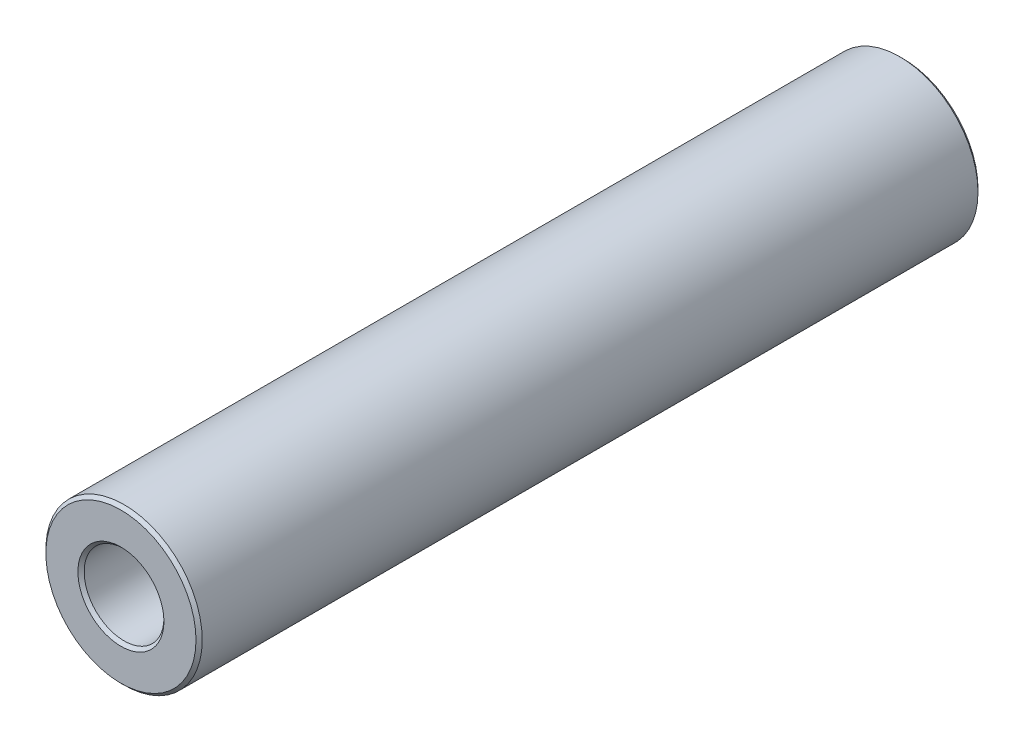
ISO-10303-21;
HEADER;
FILE_DESCRIPTION(('STEP AP214'),'2;1');
FILE_NAME('part.step','',(''),(''),'','','');
FILE_SCHEMA(('AUTOMOTIVE_DESIGN { 1 0 10303 214 1 1 1 1 }'));
ENDSEC;
DATA;
#1=APPLICATION_CONTEXT('core data for automotive mechanical design processes');
#2=APPLICATION_PROTOCOL_DEFINITION('international standard','automotive_design',2000,#1);
#3=PRODUCT_CONTEXT('',#1,'mechanical');
#4=PRODUCT('Part','Part','',(#3));
#5=PRODUCT_RELATED_PRODUCT_CATEGORY('part','',(#4));
#6=PRODUCT_DEFINITION_FORMATION('','',#4);
#7=PRODUCT_DEFINITION_CONTEXT('part definition',#1,'design');
#8=PRODUCT_DEFINITION('design','',#6,#7);
#9=PRODUCT_DEFINITION_SHAPE('','',#8);
#10=(LENGTH_UNIT() NAMED_UNIT(*) SI_UNIT(.MILLI.,.METRE.));
#11=(NAMED_UNIT(*) PLANE_ANGLE_UNIT() SI_UNIT($,.RADIAN.));
#12=(NAMED_UNIT(*) SI_UNIT($,.STERADIAN.) SOLID_ANGLE_UNIT());
#13=UNCERTAINTY_MEASURE_WITH_UNIT(LENGTH_MEASURE(1.E-05),#10,'distance_accuracy_value','');
#14=(GEOMETRIC_REPRESENTATION_CONTEXT(3) GLOBAL_UNCERTAINTY_ASSIGNED_CONTEXT((#13)) GLOBAL_UNIT_ASSIGNED_CONTEXT((#10,
#11,#12)) REPRESENTATION_CONTEXT('',''));
#15=CARTESIAN_POINT('',(0.,0.,0.));
#16=DIRECTION('',(0.,0.,1.));
#17=DIRECTION('',(1.,0.,0.));
#18=AXIS2_PLACEMENT_3D('',#15,#16,#17);
#19=CARTESIAN_POINT('',(0.,0.,50.));
#20=DIRECTION('',(0.,0.,1.));
#21=DIRECTION('',(1.,0.,0.));
#22=AXIS2_PLACEMENT_3D('',#19,#20,#21);
#23=PLANE('',#22);
#24=CARTESIAN_POINT('',(0.,0.,50.));
#25=DIRECTION('',(0.,0.,1.));
#26=DIRECTION('',(1.,0.,0.));
#27=AXIS2_PLACEMENT_3D('',#24,#25,#26);
#28=CIRCLE('',#27,2.75);
#29=CARTESIAN_POINT('',(2.75,0.,50.));
#30=VERTEX_POINT('',#29);
#31=EDGE_CURVE('E10',#30,#30,#28,.F.);
#32=ORIENTED_EDGE('',*,*,#31,.T.);
#33=EDGE_LOOP('',(#32));
#34=FACE_BOUND('',#33,.T.);
#35=CARTESIAN_POINT('',(0.,0.,50.));
#36=DIRECTION('',(0.,0.,1.));
#37=DIRECTION('',(1.,0.,0.));
#38=AXIS2_PLACEMENT_3D('',#35,#36,#37);
#39=CIRCLE('',#38,4.8);
#40=CARTESIAN_POINT('',(4.8,0.,50.));
#41=VERTEX_POINT('',#40);
#42=EDGE_CURVE('E37',#41,#41,#39,.T.);
#43=ORIENTED_EDGE('',*,*,#42,.T.);
#44=EDGE_LOOP('',(#43));
#45=FACE_BOUND('',#44,.T.);
#46=ADVANCED_FACE('F30',(#34,#45),#23,.T.);
#47=CARTESIAN_POINT('',(0.,0.,0.));
#48=DIRECTION('',(0.,0.,1.));
#49=DIRECTION('',(1.,0.,0.));
#50=AXIS2_PLACEMENT_3D('',#47,#48,#49);
#51=PLANE('',#50);
#52=CARTESIAN_POINT('',(0.,0.,0.));
#53=DIRECTION('',(0.,0.,1.));
#54=DIRECTION('',(1.,0.,0.));
#55=AXIS2_PLACEMENT_3D('',#52,#53,#54);
#56=CIRCLE('',#55,4.80000000000001);
#57=CARTESIAN_POINT('',(4.80000000000001,0.,0.));
#58=VERTEX_POINT('',#57);
#59=EDGE_CURVE('E50',#58,#58,#56,.F.);
#60=ORIENTED_EDGE('',*,*,#59,.T.);
#61=EDGE_LOOP('',(#60));
#62=FACE_BOUND('',#61,.T.);
#63=CARTESIAN_POINT('',(0.,0.,0.));
#64=DIRECTION('',(0.,0.,1.));
#65=DIRECTION('',(1.,0.,0.));
#66=AXIS2_PLACEMENT_3D('',#63,#64,#65);
#67=CIRCLE('',#66,2.75);
#68=CARTESIAN_POINT('',(2.75,0.,0.));
#69=VERTEX_POINT('',#68);
#70=EDGE_CURVE('E53',#69,#69,#67,.T.);
#71=ORIENTED_EDGE('',*,*,#70,.T.);
#72=EDGE_LOOP('',(#71));
#73=FACE_BOUND('',#72,.T.);
#74=ADVANCED_FACE('F74',(#62,#73),#51,.F.);
#75=CARTESIAN_POINT('',(0.,0.,50.));
#76=DIRECTION('',(0.,0.,-1.));
#77=DIRECTION('',(-1.,0.,0.));
#78=AXIS2_PLACEMENT_3D('',#75,#76,#77);
#79=CYLINDRICAL_SURFACE('',#78,5.);
#80=CARTESIAN_POINT('',(0.,0.,0.199999999999992));
#81=DIRECTION('',(0.,0.,1.));
#82=DIRECTION('',(1.,0.,0.));
#83=AXIS2_PLACEMENT_3D('',#80,#81,#82);
#84=CIRCLE('',#83,5.);
#85=CARTESIAN_POINT('',(5.,0.,0.199999999999992));
#86=VERTEX_POINT('',#85);
#87=EDGE_CURVE('E56',#86,#86,#84,.T.);
#88=ORIENTED_EDGE('',*,*,#87,.T.);
#89=EDGE_LOOP('',(#88));
#90=FACE_BOUND('',#89,.T.);
#91=CARTESIAN_POINT('',(0.,0.,49.8));
#92=DIRECTION('',(0.,0.,1.));
#93=DIRECTION('',(1.,0.,0.));
#94=AXIS2_PLACEMENT_3D('',#91,#92,#93);
#95=CIRCLE('',#94,5.);
#96=CARTESIAN_POINT('',(5.,0.,49.8));
#97=VERTEX_POINT('',#96);
#98=EDGE_CURVE('E59',#97,#97,#95,.F.);
#99=ORIENTED_EDGE('',*,*,#98,.T.);
#100=EDGE_LOOP('',(#99));
#101=FACE_BOUND('',#100,.T.);
#102=ADVANCED_FACE('F63',(#90,#101),#79,.T.);
#103=CARTESIAN_POINT('',(0.,0.,50.));
#104=DIRECTION('',(0.,0.,-1.));
#105=DIRECTION('',(-1.,0.,0.));
#106=AXIS2_PLACEMENT_3D('',#103,#104,#105);
#107=CYLINDRICAL_SURFACE('',#106,2.55);
#108=CARTESIAN_POINT('',(0.,0.,0.200000000000006));
#109=DIRECTION('',(0.,0.,1.));
#110=DIRECTION('',(1.,0.,0.));
#111=AXIS2_PLACEMENT_3D('',#108,#109,#110);
#112=CIRCLE('',#111,2.55);
#113=CARTESIAN_POINT('',(2.55,0.,0.200000000000006));
#114=VERTEX_POINT('',#113);
#115=EDGE_CURVE('E41',#114,#114,#112,.F.);
#116=ORIENTED_EDGE('',*,*,#115,.T.);
#117=EDGE_LOOP('',(#116));
#118=FACE_BOUND('',#117,.T.);
#119=CARTESIAN_POINT('',(0.,0.,49.8));
#120=DIRECTION('',(0.,0.,1.));
#121=DIRECTION('',(1.,0.,0.));
#122=AXIS2_PLACEMENT_3D('',#119,#120,#121);
#123=CIRCLE('',#122,2.55);
#124=CARTESIAN_POINT('',(2.55,0.,49.8));
#125=VERTEX_POINT('',#124);
#126=EDGE_CURVE('E45',#125,#125,#123,.T.);
#127=ORIENTED_EDGE('',*,*,#126,.T.);
#128=EDGE_LOOP('',(#127));
#129=FACE_BOUND('',#128,.T.);
#130=ADVANCED_FACE('F82',(#118,#129),#107,.F.);
#131=CARTESIAN_POINT('',(0.,0.,0.199999999999992));
#132=DIRECTION('',(0.,0.,1.));
#133=DIRECTION('',(1.,0.,0.));
#134=AXIS2_PLACEMENT_3D('',#131,#132,#133);
#135=CONICAL_SURFACE('',#134,5.,0.785398163397455);
#136=ORIENTED_EDGE('',*,*,#59,.F.);
#137=EDGE_LOOP('',(#136));
#138=FACE_BOUND('',#137,.T.);
#139=ORIENTED_EDGE('',*,*,#87,.F.);
#140=EDGE_LOOP('',(#139));
#141=FACE_BOUND('',#140,.T.);
#142=ADVANCED_FACE('F87',(#138,#141),#135,.T.);
#143=CARTESIAN_POINT('',(0.,0.,0.));
#144=DIRECTION('',(0.,0.,-1.));
#145=DIRECTION('',(-1.,0.,0.));
#146=AXIS2_PLACEMENT_3D('',#143,#144,#145);
#147=CONICAL_SURFACE('',#146,2.75,0.785398163397423);
#148=ORIENTED_EDGE('',*,*,#115,.F.);
#149=EDGE_LOOP('',(#148));
#150=FACE_BOUND('',#149,.T.);
#151=ORIENTED_EDGE('',*,*,#70,.F.);
#152=EDGE_LOOP('',(#151));
#153=FACE_BOUND('',#152,.T.);
#154=ADVANCED_FACE('F71',(#150,#153),#147,.F.);
#155=CARTESIAN_POINT('',(0.,0.,49.8));
#156=DIRECTION('',(0.,0.,1.));
#157=DIRECTION('',(1.,0.,0.));
#158=AXIS2_PLACEMENT_3D('',#155,#156,#157);
#159=CONICAL_SURFACE('',#158,2.55,0.785398163397458);
#160=ORIENTED_EDGE('',*,*,#31,.F.);
#161=EDGE_LOOP('',(#160));
#162=FACE_BOUND('',#161,.T.);
#163=ORIENTED_EDGE('',*,*,#126,.F.);
#164=EDGE_LOOP('',(#163));
#165=FACE_BOUND('',#164,.T.);
#166=ADVANCED_FACE('F67',(#162,#165),#159,.F.);
#167=CARTESIAN_POINT('',(0.,0.,50.));
#168=DIRECTION('',(0.,0.,-1.));
#169=DIRECTION('',(-1.,0.,0.));
#170=AXIS2_PLACEMENT_3D('',#167,#168,#169);
#171=CONICAL_SURFACE('',#170,4.8,0.785398163397455);
#172=ORIENTED_EDGE('',*,*,#98,.F.);
#173=EDGE_LOOP('',(#172));
#174=FACE_BOUND('',#173,.T.);
#175=ORIENTED_EDGE('',*,*,#42,.F.);
#176=EDGE_LOOP('',(#175));
#177=FACE_BOUND('',#176,.T.);
#178=ADVANCED_FACE('F32',(#174,#177),#171,.T.);
#179=CLOSED_SHELL('',(#46,#74,#102,#130,#142,#154,#166,#178));
#180=MANIFOLD_SOLID_BREP('B2',#179);
#181=ADVANCED_BREP_SHAPE_REPRESENTATION('',(#18,#180),#14);
#182=SHAPE_DEFINITION_REPRESENTATION(#9,#181);
ENDSEC;
END-ISO-10303-21;
